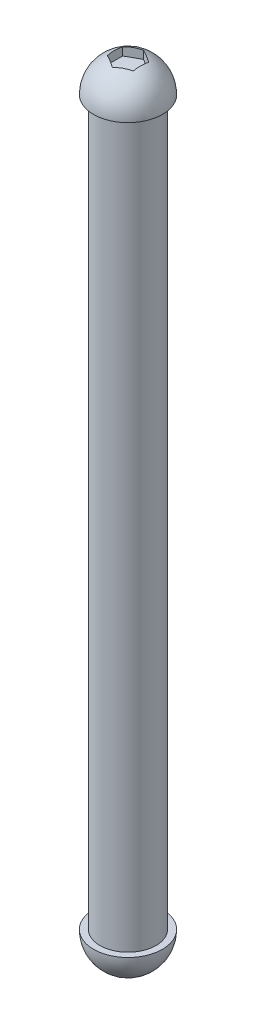
ISO-10303-21;
HEADER;
FILE_DESCRIPTION(('STEP AP214'),'2;1');
FILE_NAME('part.step','',(''),(''),'','','');
FILE_SCHEMA(('AUTOMOTIVE_DESIGN { 1 0 10303 214 1 1 1 1 }'));
ENDSEC;
DATA;
#1=APPLICATION_CONTEXT('core data for automotive mechanical design processes');
#2=APPLICATION_PROTOCOL_DEFINITION('international standard','automotive_design',2000,#1);
#3=PRODUCT_CONTEXT('',#1,'mechanical');
#4=PRODUCT('Part','Part','',(#3));
#5=PRODUCT_RELATED_PRODUCT_CATEGORY('part','',(#4));
#6=PRODUCT_DEFINITION_FORMATION('','',#4);
#7=PRODUCT_DEFINITION_CONTEXT('part definition',#1,'design');
#8=PRODUCT_DEFINITION('design','',#6,#7);
#9=PRODUCT_DEFINITION_SHAPE('','',#8);
#10=(LENGTH_UNIT() NAMED_UNIT(*) SI_UNIT(.MILLI.,.METRE.));
#11=(NAMED_UNIT(*) PLANE_ANGLE_UNIT() SI_UNIT($,.RADIAN.));
#12=(NAMED_UNIT(*) SI_UNIT($,.STERADIAN.) SOLID_ANGLE_UNIT());
#13=UNCERTAINTY_MEASURE_WITH_UNIT(LENGTH_MEASURE(1.E-05),#10,'distance_accuracy_value','');
#14=(GEOMETRIC_REPRESENTATION_CONTEXT(3) GLOBAL_UNCERTAINTY_ASSIGNED_CONTEXT((#13)) GLOBAL_UNIT_ASSIGNED_CONTEXT((#10,
#11,#12)) REPRESENTATION_CONTEXT('',''));
#15=CARTESIAN_POINT('',(0.,0.,0.));
#16=DIRECTION('',(0.,0.,1.));
#17=DIRECTION('',(1.,0.,0.));
#18=AXIS2_PLACEMENT_3D('',#15,#16,#17);
#19=CARTESIAN_POINT('',(0.,0.,0.));
#20=DIRECTION('',(0.0757388786567332,0.,-0.997127686036157));
#21=DIRECTION('',(-0.997127686036157,0.,-0.0757388786567332));
#22=AXIS2_PLACEMENT_3D('',#19,#20,#21);
#23=SPHERICAL_SURFACE('',#22,3.);
#24=CARTESIAN_POINT('',(-0.591036564901015,0.,0.987830611369554));
#25=DIRECTION('',(-0.513433884385675,0.,0.858129154827312));
#26=DIRECTION('',(0.858129154827312,0.,0.513433884385675));
#27=AXIS2_PLACEMENT_3D('',#24,#25,#26);
#28=CIRCLE('',#27,2.77035493433446);
#29=CARTESIAN_POINT('',(-0.0207122955130502,-2.68945259912156,1.32906573121607));
#30=VERTEX_POINT('',#29);
#31=CARTESIAN_POINT('',(-1.16136083428898,-2.68945259912156,0.646595491523041));
#32=VERTEX_POINT('',#31);
#33=EDGE_CURVE('E48',#30,#32,#28,.F.);
#34=ORIENTED_EDGE('',*,*,#33,.F.);
#35=CARTESIAN_POINT('',(0.559968121631439,0.,1.00576798545455));
#36=DIRECTION('',(0.486444705615685,0.,0.873711364455373));
#37=DIRECTION('',(0.873711364455373,0.,-0.486444705615685));
#38=AXIS2_PLACEMENT_3D('',#35,#36,#37);
#39=CIRCLE('',#38,2.77035493433446);
#40=CARTESIAN_POINT('',(1.14064853877593,-2.68945259912156,0.682470239693026));
#41=VERTEX_POINT('',#40);
#42=EDGE_CURVE('E63',#41,#30,#39,.F.);
#43=ORIENTED_EDGE('',*,*,#42,.F.);
#44=CARTESIAN_POINT('',(1.15100468653246,0.,0.0179373740849928));
#45=DIRECTION('',(0.99987859000136,0.,0.0155822096280604));
#46=DIRECTION('',(0.0155822096280604,0.,-0.99987859000136));
#47=AXIS2_PLACEMENT_3D('',#44,#45,#46);
#48=CIRCLE('',#47,2.77035493433446);
#49=CARTESIAN_POINT('',(1.16136083428898,-2.68945259912156,-0.646595491523042));
#50=VERTEX_POINT('',#49);
#51=EDGE_CURVE('E233',#50,#41,#48,.F.);
#52=ORIENTED_EDGE('',*,*,#51,.F.);
#53=CARTESIAN_POINT('',(0.591036564901016,0.,-0.987830611369555));
#54=DIRECTION('',(0.513433884385675,0.,-0.858129154827312));
#55=DIRECTION('',(-0.858129154827312,0.,-0.513433884385675));
#56=AXIS2_PLACEMENT_3D('',#53,#54,#55);
#57=CIRCLE('',#56,2.77035493433446);
#58=CARTESIAN_POINT('',(0.0207122955130501,-2.68945259912156,-1.32906573121607));
#59=VERTEX_POINT('',#58);
#60=EDGE_CURVE('E231',#59,#50,#57,.F.);
#61=ORIENTED_EDGE('',*,*,#60,.F.);
#62=CARTESIAN_POINT('',(-0.559968121631441,0.,-1.00576798545455));
#63=DIRECTION('',(-0.486444705615685,0.,-0.873711364455373));
#64=DIRECTION('',(-0.873711364455373,0.,0.486444705615685));
#65=AXIS2_PLACEMENT_3D('',#62,#63,#64);
#66=CIRCLE('',#65,2.77035493433446);
#67=CARTESIAN_POINT('',(-1.14064853877593,-2.68945259912156,-0.682470239693026));
#68=VERTEX_POINT('',#67);
#69=EDGE_CURVE('E229',#68,#59,#66,.F.);
#70=ORIENTED_EDGE('',*,*,#69,.F.);
#71=CARTESIAN_POINT('',(-1.15100468653246,0.,-0.0179373740849914));
#72=DIRECTION('',(-0.99987859000136,0.,-0.0155822096280607));
#73=DIRECTION('',(-0.0155822096280607,0.,0.99987859000136));
#74=AXIS2_PLACEMENT_3D('',#71,#72,#73);
#75=CIRCLE('',#74,2.77035493433446);
#76=EDGE_CURVE('E227',#32,#68,#75,.F.);
#77=ORIENTED_EDGE('',*,*,#76,.F.);
#78=EDGE_LOOP('',(#34,#43,#52,#61,#70,#77));
#79=FACE_BOUND('',#78,.T.);
#80=CARTESIAN_POINT('',(0.,0.,0.));
#81=DIRECTION('',(0.,-1.,0.));
#82=DIRECTION('',(-0.151042665635923,0.,0.988527244519642));
#83=AXIS2_PLACEMENT_3D('',#80,#81,#82);
#84=CIRCLE('',#83,3.);
#85=CARTESIAN_POINT('',(-0.45312799690777,0.,2.96558173355893));
#86=VERTEX_POINT('',#85);
#87=EDGE_CURVE('E212',#86,#86,#84,.T.);
#88=ORIENTED_EDGE('',*,*,#87,.T.);
#89=EDGE_LOOP('',(#88));
#90=FACE_BOUND('',#89,.T.);
#91=ADVANCED_FACE('F41',(#79,#90),#23,.T.);
#92=CARTESIAN_POINT('',(0.,0.,0.));
#93=DIRECTION('',(0.,-1.,0.));
#94=DIRECTION('',(-0.151042665635923,0.,0.988527244519642));
#95=AXIS2_PLACEMENT_3D('',#92,#93,#94);
#96=PLANE('',#95);
#97=CARTESIAN_POINT('',(0.,0.,0.));
#98=DIRECTION('',(0.,-1.,0.));
#99=DIRECTION('',(1.,0.,0.));
#100=AXIS2_PLACEMENT_3D('',#97,#98,#99);
#101=CIRCLE('',#100,2.44);
#102=CARTESIAN_POINT('',(2.44,0.,0.));
#103=VERTEX_POINT('',#102);
#104=EDGE_CURVE('E11',#103,#103,#101,.F.);
#105=ORIENTED_EDGE('',*,*,#104,.F.);
#106=EDGE_LOOP('',(#105));
#107=FACE_BOUND('',#106,.T.);
#108=ORIENTED_EDGE('',*,*,#87,.F.);
#109=EDGE_LOOP('',(#108));
#110=FACE_BOUND('',#109,.T.);
#111=ADVANCED_FACE('F268',(#107,#110),#96,.F.);
#112=CARTESIAN_POINT('',(-0.0207122955130502,-2.,1.32906573121607));
#113=DIRECTION('',(-0.513433884385675,0.,0.858129154827312));
#114=DIRECTION('',(0.858129154827312,0.,0.513433884385675));
#115=AXIS2_PLACEMENT_3D('',#112,#113,#114);
#116=PLANE('',#115);
#117=ORIENTED_EDGE('',*,*,#33,.T.);
#118=DIRECTION('',(0.,-1.,0.));
#119=VECTOR('',#118,1.);
#120=CARTESIAN_POINT('',(-1.16136083428898,-2.,0.646595491523041));
#121=LINE('',#120,#119);
#122=CARTESIAN_POINT('',(-1.16136083428898,-2.,0.646595491523041));
#123=VERTEX_POINT('',#122);
#124=EDGE_CURVE('E55',#123,#32,#121,.T.);
#125=ORIENTED_EDGE('',*,*,#124,.F.);
#126=DIRECTION('',(-0.858129154827312,0.,-0.513433884385675));
#127=VECTOR('',#126,1.);
#128=CARTESIAN_POINT('',(-0.0207122955130502,-2.,1.32906573121607));
#129=LINE('',#128,#127);
#130=CARTESIAN_POINT('',(-0.0207122955130502,-2.,1.32906573121607));
#131=VERTEX_POINT('',#130);
#132=EDGE_CURVE('E192',#131,#123,#129,.T.);
#133=ORIENTED_EDGE('',*,*,#132,.F.);
#134=DIRECTION('',(0.,-1.,0.));
#135=VECTOR('',#134,1.);
#136=CARTESIAN_POINT('',(-0.0207122955130502,-2.,1.32906573121607));
#137=LINE('',#136,#135);
#138=EDGE_CURVE('E210',#131,#30,#137,.T.);
#139=ORIENTED_EDGE('',*,*,#138,.T.);
#140=EDGE_LOOP('',(#117,#125,#133,#139));
#141=FACE_BOUND('',#140,.T.);
#142=ADVANCED_FACE('F238',(#141),#116,.F.);
#143=CARTESIAN_POINT('',(1.14064853877593,-2.,0.682470239693025));
#144=DIRECTION('',(0.486444705615685,0.,0.873711364455373));
#145=DIRECTION('',(0.873711364455373,0.,-0.486444705615685));
#146=AXIS2_PLACEMENT_3D('',#143,#144,#145);
#147=PLANE('',#146);
#148=ORIENTED_EDGE('',*,*,#42,.T.);
#149=ORIENTED_EDGE('',*,*,#138,.F.);
#150=DIRECTION('',(-0.873711364455373,0.,0.486444705615685));
#151=VECTOR('',#150,1.);
#152=CARTESIAN_POINT('',(1.14064853877593,-2.,0.682470239693025));
#153=LINE('',#152,#151);
#154=CARTESIAN_POINT('',(1.14064853877593,-2.,0.682470239693025));
#155=VERTEX_POINT('',#154);
#156=EDGE_CURVE('E207',#155,#131,#153,.T.);
#157=ORIENTED_EDGE('',*,*,#156,.F.);
#158=DIRECTION('',(0.,-1.,0.));
#159=VECTOR('',#158,1.);
#160=CARTESIAN_POINT('',(1.14064853877593,-2.,0.682470239693025));
#161=LINE('',#160,#159);
#162=EDGE_CURVE('E213',#155,#41,#161,.T.);
#163=ORIENTED_EDGE('',*,*,#162,.T.);
#164=EDGE_LOOP('',(#148,#149,#157,#163));
#165=FACE_BOUND('',#164,.T.);
#166=ADVANCED_FACE('F253',(#165),#147,.F.);
#167=CARTESIAN_POINT('',(1.16136083428898,-2.,-0.646595491523042));
#168=DIRECTION('',(0.99987859000136,0.,0.0155822096280604));
#169=DIRECTION('',(0.0155822096280604,0.,-0.99987859000136));
#170=AXIS2_PLACEMENT_3D('',#167,#168,#169);
#171=PLANE('',#170);
#172=ORIENTED_EDGE('',*,*,#51,.T.);
#173=ORIENTED_EDGE('',*,*,#162,.F.);
#174=DIRECTION('',(-0.0155822096280604,0.,0.99987859000136));
#175=VECTOR('',#174,1.);
#176=CARTESIAN_POINT('',(1.16136083428898,-2.,-0.646595491523042));
#177=LINE('',#176,#175);
#178=CARTESIAN_POINT('',(1.16136083428898,-2.,-0.646595491523042));
#179=VERTEX_POINT('',#178);
#180=EDGE_CURVE('E204',#179,#155,#177,.T.);
#181=ORIENTED_EDGE('',*,*,#180,.F.);
#182=DIRECTION('',(0.,-1.,0.));
#183=VECTOR('',#182,1.);
#184=CARTESIAN_POINT('',(1.16136083428898,-2.,-0.646595491523042));
#185=LINE('',#184,#183);
#186=EDGE_CURVE('E215',#179,#50,#185,.T.);
#187=ORIENTED_EDGE('',*,*,#186,.T.);
#188=EDGE_LOOP('',(#172,#173,#181,#187));
#189=FACE_BOUND('',#188,.T.);
#190=ADVANCED_FACE('F256',(#189),#171,.F.);
#191=CARTESIAN_POINT('',(0.0207122955130502,-2.,-1.32906573121607));
#192=DIRECTION('',(0.513433884385675,0.,-0.858129154827312));
#193=DIRECTION('',(-0.858129154827312,0.,-0.513433884385675));
#194=AXIS2_PLACEMENT_3D('',#191,#192,#193);
#195=PLANE('',#194);
#196=ORIENTED_EDGE('',*,*,#60,.T.);
#197=ORIENTED_EDGE('',*,*,#186,.F.);
#198=DIRECTION('',(0.858129154827312,0.,0.513433884385675));
#199=VECTOR('',#198,1.);
#200=CARTESIAN_POINT('',(0.0207122955130502,-2.,-1.32906573121607));
#201=LINE('',#200,#199);
#202=CARTESIAN_POINT('',(0.0207122955130502,-2.,-1.32906573121607));
#203=VERTEX_POINT('',#202);
#204=EDGE_CURVE('E201',#203,#179,#201,.T.);
#205=ORIENTED_EDGE('',*,*,#204,.F.);
#206=DIRECTION('',(0.,-1.,0.));
#207=VECTOR('',#206,1.);
#208=CARTESIAN_POINT('',(0.0207122955130502,-2.,-1.32906573121607));
#209=LINE('',#208,#207);
#210=EDGE_CURVE('E218',#203,#59,#209,.T.);
#211=ORIENTED_EDGE('',*,*,#210,.T.);
#212=EDGE_LOOP('',(#196,#197,#205,#211));
#213=FACE_BOUND('',#212,.T.);
#214=ADVANCED_FACE('F258',(#213),#195,.F.);
#215=CARTESIAN_POINT('',(-1.14064853877593,-2.,-0.682470239693026));
#216=DIRECTION('',(-0.486444705615685,0.,-0.873711364455373));
#217=DIRECTION('',(-0.873711364455373,0.,0.486444705615685));
#218=AXIS2_PLACEMENT_3D('',#215,#216,#217);
#219=PLANE('',#218);
#220=ORIENTED_EDGE('',*,*,#69,.T.);
#221=ORIENTED_EDGE('',*,*,#210,.F.);
#222=DIRECTION('',(0.873711364455373,0.,-0.486444705615685));
#223=VECTOR('',#222,1.);
#224=CARTESIAN_POINT('',(-1.14064853877593,-2.,-0.682470239693026));
#225=LINE('',#224,#223);
#226=CARTESIAN_POINT('',(-1.14064853877593,-2.,-0.682470239693026));
#227=VERTEX_POINT('',#226);
#228=EDGE_CURVE('E198',#227,#203,#225,.T.);
#229=ORIENTED_EDGE('',*,*,#228,.F.);
#230=DIRECTION('',(0.,-1.,0.));
#231=VECTOR('',#230,1.);
#232=CARTESIAN_POINT('',(-1.14064853877593,-2.,-0.682470239693026));
#233=LINE('',#232,#231);
#234=EDGE_CURVE('E221',#227,#68,#233,.T.);
#235=ORIENTED_EDGE('',*,*,#234,.T.);
#236=EDGE_LOOP('',(#220,#221,#229,#235));
#237=FACE_BOUND('',#236,.T.);
#238=ADVANCED_FACE('F247',(#237),#219,.F.);
#239=CARTESIAN_POINT('',(-1.16136083428898,-2.,0.646595491523041));
#240=DIRECTION('',(-0.99987859000136,0.,-0.0155822096280607));
#241=DIRECTION('',(-0.0155822096280607,0.,0.99987859000136));
#242=AXIS2_PLACEMENT_3D('',#239,#240,#241);
#243=PLANE('',#242);
#244=ORIENTED_EDGE('',*,*,#76,.T.);
#245=ORIENTED_EDGE('',*,*,#234,.F.);
#246=DIRECTION('',(0.0155822096280607,0.,-0.99987859000136));
#247=VECTOR('',#246,1.);
#248=CARTESIAN_POINT('',(-1.16136083428898,-2.,0.646595491523041));
#249=LINE('',#248,#247);
#250=EDGE_CURVE('E195',#123,#227,#249,.T.);
#251=ORIENTED_EDGE('',*,*,#250,.F.);
#252=ORIENTED_EDGE('',*,*,#124,.T.);
#253=EDGE_LOOP('',(#244,#245,#251,#252));
#254=FACE_BOUND('',#253,.T.);
#255=ADVANCED_FACE('F244',(#254),#243,.F.);
#256=CARTESIAN_POINT('',(0.,-2.,0.));
#257=DIRECTION('',(0.,-1.,0.));
#258=DIRECTION('',(0.,0.,-1.));
#259=AXIS2_PLACEMENT_3D('',#256,#257,#258);
#260=PLANE('',#259);
#261=ORIENTED_EDGE('',*,*,#132,.T.);
#262=ORIENTED_EDGE('',*,*,#250,.T.);
#263=ORIENTED_EDGE('',*,*,#228,.T.);
#264=ORIENTED_EDGE('',*,*,#204,.T.);
#265=ORIENTED_EDGE('',*,*,#180,.T.);
#266=ORIENTED_EDGE('',*,*,#156,.T.);
#267=EDGE_LOOP('',(#261,#262,#263,#264,#265,#266));
#268=FACE_BOUND('',#267,.T.);
#269=ADVANCED_FACE('F250',(#268),#260,.T.);
#270=CARTESIAN_POINT('',(-2.19331520619062E-13,31.5,0.));
#271=DIRECTION('',(0.,-1.,0.));
#272=DIRECTION('',(1.,0.,0.));
#273=AXIS2_PLACEMENT_3D('',#270,#271,#272);
#274=CYLINDRICAL_SURFACE('',#273,2.44);
#275=ORIENTED_EDGE('',*,*,#104,.T.);
#276=EDGE_LOOP('',(#275));
#277=FACE_BOUND('',#276,.T.);
#278=CARTESIAN_POINT('',(-4.38663041238124E-13,63.,0.));
#279=DIRECTION('',(0.,-1.,0.));
#280=DIRECTION('',(1.,0.,0.));
#281=AXIS2_PLACEMENT_3D('',#278,#279,#280);
#282=CIRCLE('',#281,2.44);
#283=CARTESIAN_POINT('',(2.43999999999956,63.,0.));
#284=VERTEX_POINT('',#283);
#285=EDGE_CURVE('E189',#284,#284,#282,.F.);
#286=ORIENTED_EDGE('',*,*,#285,.F.);
#287=EDGE_LOOP('',(#286));
#288=FACE_BOUND('',#287,.T.);
#289=ADVANCED_FACE('F284',(#277,#288),#274,.T.);
#290=CARTESIAN_POINT('',(-4.38771461455372E-13,63.,0.));
#291=DIRECTION('',(0.0757388786567332,0.,-0.997127686036157));
#292=DIRECTION('',(-0.997127686036157,0.,-0.0757388786567332));
#293=AXIS2_PLACEMENT_3D('',#290,#291,#292);
#294=SPHERICAL_SURFACE('',#293,3.);
#295=CARTESIAN_POINT('',(-0.591036564901454,63.,0.987830611369521));
#296=DIRECTION('',(0.513433884385675,0.,-0.858129154827312));
#297=DIRECTION('',(0.858129154827312,0.,0.513433884385675));
#298=AXIS2_PLACEMENT_3D('',#295,#296,#297);
#299=CIRCLE('',#298,2.77035493433446);
#300=CARTESIAN_POINT('',(-0.0207122955135263,65.6894525991216,1.32906573121603));
#301=VERTEX_POINT('',#300);
#302=CARTESIAN_POINT('',(-1.16136083428946,65.6894525991215,0.646595491523005));
#303=VERTEX_POINT('',#302);
#304=EDGE_CURVE('E187',#301,#303,#299,.F.);
#305=ORIENTED_EDGE('',*,*,#304,.T.);
#306=CARTESIAN_POINT('',(-1.15100468653289,63.,-0.0179373740850248));
#307=DIRECTION('',(0.99987859000136,0.,0.0155822096280607));
#308=DIRECTION('',(-0.0155822096280607,0.,0.99987859000136));
#309=AXIS2_PLACEMENT_3D('',#306,#307,#308);
#310=CIRCLE('',#309,2.77035493433446);
#311=CARTESIAN_POINT('',(-1.14064853877641,65.6894525991215,-0.682470239693062));
#312=VERTEX_POINT('',#311);
#313=EDGE_CURVE('E146',#303,#312,#310,.F.);
#314=ORIENTED_EDGE('',*,*,#313,.T.);
#315=CARTESIAN_POINT('',(-0.559968121631879,63.,-1.00576798545458));
#316=DIRECTION('',(0.486444705615685,0.,0.873711364455373));
#317=DIRECTION('',(-0.873711364455373,0.,0.486444705615685));
#318=AXIS2_PLACEMENT_3D('',#315,#316,#317);
#319=CIRCLE('',#318,2.77035493433446);
#320=CARTESIAN_POINT('',(0.020712295512574,65.6894525991216,-1.3290657312161));
#321=VERTEX_POINT('',#320);
#322=EDGE_CURVE('E175',#312,#321,#319,.F.);
#323=ORIENTED_EDGE('',*,*,#322,.T.);
#324=CARTESIAN_POINT('',(0.591036564900577,63.,-0.987830611369588));
#325=DIRECTION('',(-0.513433884385675,0.,0.858129154827312));
#326=DIRECTION('',(-0.858129154827312,0.,-0.513433884385675));
#327=AXIS2_PLACEMENT_3D('',#324,#325,#326);
#328=CIRCLE('',#327,2.77035493433446);
#329=CARTESIAN_POINT('',(1.1613608342885,65.6894525991216,-0.646595491523078));
#330=VERTEX_POINT('',#329);
#331=EDGE_CURVE('E178',#321,#330,#328,.F.);
#332=ORIENTED_EDGE('',*,*,#331,.T.);
#333=CARTESIAN_POINT('',(1.15100468653202,63.,0.0179373740849595));
#334=DIRECTION('',(-0.99987859000136,0.,-0.0155822096280604));
#335=DIRECTION('',(0.0155822096280604,0.,-0.99987859000136));
#336=AXIS2_PLACEMENT_3D('',#333,#334,#335);
#337=CIRCLE('',#336,2.77035493433446);
#338=CARTESIAN_POINT('',(1.14064853877545,65.6894525991216,0.682470239692989));
#339=VERTEX_POINT('',#338);
#340=EDGE_CURVE('E181',#330,#339,#337,.F.);
#341=ORIENTED_EDGE('',*,*,#340,.T.);
#342=CARTESIAN_POINT('',(0.559968121631001,63.,1.00576798545451));
#343=DIRECTION('',(-0.486444705615685,0.,-0.873711364455373));
#344=DIRECTION('',(0.873711364455373,0.,-0.486444705615685));
#345=AXIS2_PLACEMENT_3D('',#342,#343,#344);
#346=CIRCLE('',#345,2.77035493433446);
#347=EDGE_CURVE('E184',#339,#301,#346,.F.);
#348=ORIENTED_EDGE('',*,*,#347,.T.);
#349=EDGE_LOOP('',(#305,#314,#323,#332,#341,#348));
#350=FACE_BOUND('',#349,.T.);
#351=CARTESIAN_POINT('',(-4.38771461455372E-13,63.,0.));
#352=DIRECTION('',(0.,-1.,0.));
#353=DIRECTION('',(-0.151042665635923,0.,0.988527244519642));
#354=AXIS2_PLACEMENT_3D('',#351,#352,#353);
#355=CIRCLE('',#354,3.);
#356=CARTESIAN_POINT('',(-0.453127996908209,63.,2.9655817335589));
#357=VERTEX_POINT('',#356);
#358=EDGE_CURVE('E164',#357,#357,#355,.T.);
#359=ORIENTED_EDGE('',*,*,#358,.F.);
#360=EDGE_LOOP('',(#359));
#361=FACE_BOUND('',#360,.T.);
#362=ADVANCED_FACE('F289',(#350,#361),#294,.T.);
#363=CARTESIAN_POINT('',(-4.38771461455372E-13,63.,0.));
#364=DIRECTION('',(0.,1.,0.));
#365=DIRECTION('',(-0.151042665635923,0.,0.988527244519642));
#366=AXIS2_PLACEMENT_3D('',#363,#364,#365);
#367=PLANE('',#366);
#368=ORIENTED_EDGE('',*,*,#285,.T.);
#369=EDGE_LOOP('',(#368));
#370=FACE_BOUND('',#369,.T.);
#371=ORIENTED_EDGE('',*,*,#358,.T.);
#372=EDGE_LOOP('',(#371));
#373=FACE_BOUND('',#372,.T.);
#374=ADVANCED_FACE('F356',(#370,#373),#367,.F.);
#375=CARTESIAN_POINT('',(-0.0207122955135167,65.,1.32906573121603));
#376=DIRECTION('',(-0.513433884385675,0.,0.858129154827312));
#377=DIRECTION('',(0.858129154827312,0.,0.513433884385675));
#378=AXIS2_PLACEMENT_3D('',#375,#376,#377);
#379=PLANE('',#378);
#380=ORIENTED_EDGE('',*,*,#304,.F.);
#381=DIRECTION('',(0.,1.,0.));
#382=VECTOR('',#381,1.);
#383=CARTESIAN_POINT('',(-0.0207122955135167,65.,1.32906573121603));
#384=LINE('',#383,#382);
#385=CARTESIAN_POINT('',(-0.0207122955135167,65.,1.32906573121603));
#386=VERTEX_POINT('',#385);
#387=EDGE_CURVE('E154',#386,#301,#384,.T.);
#388=ORIENTED_EDGE('',*,*,#387,.F.);
#389=DIRECTION('',(-0.858129154827312,0.,-0.513433884385675));
#390=VECTOR('',#389,1.);
#391=CARTESIAN_POINT('',(-0.0207122955135167,65.,1.32906573121603));
#392=LINE('',#391,#390);
#393=CARTESIAN_POINT('',(-1.16136083428945,65.,0.646595491523005));
#394=VERTEX_POINT('',#393);
#395=EDGE_CURVE('E135',#386,#394,#392,.T.);
#396=ORIENTED_EDGE('',*,*,#395,.T.);
#397=DIRECTION('',(0.,1.,0.));
#398=VECTOR('',#397,1.);
#399=CARTESIAN_POINT('',(-1.16136083428945,65.,0.646595491523005));
#400=LINE('',#399,#398);
#401=EDGE_CURVE('E143',#394,#303,#400,.T.);
#402=ORIENTED_EDGE('',*,*,#401,.T.);
#403=EDGE_LOOP('',(#380,#388,#396,#402));
#404=FACE_BOUND('',#403,.T.);
#405=ADVANCED_FACE('F153',(#404),#379,.F.);
#406=CARTESIAN_POINT('',(1.14064853877546,65.,0.68247023969299));
#407=DIRECTION('',(0.486444705615685,0.,0.873711364455373));
#408=DIRECTION('',(0.873711364455373,0.,-0.486444705615685));
#409=AXIS2_PLACEMENT_3D('',#406,#407,#408);
#410=PLANE('',#409);
#411=ORIENTED_EDGE('',*,*,#347,.F.);
#412=DIRECTION('',(0.,1.,0.));
#413=VECTOR('',#412,1.);
#414=CARTESIAN_POINT('',(1.14064853877546,65.,0.68247023969299));
#415=LINE('',#414,#413);
#416=CARTESIAN_POINT('',(1.14064853877546,65.,0.68247023969299));
#417=VERTEX_POINT('',#416);
#418=EDGE_CURVE('E165',#417,#339,#415,.T.);
#419=ORIENTED_EDGE('',*,*,#418,.F.);
#420=DIRECTION('',(-0.873711364455373,0.,0.486444705615685));
#421=VECTOR('',#420,1.);
#422=CARTESIAN_POINT('',(1.14064853877546,65.,0.68247023969299));
#423=LINE('',#422,#421);
#424=EDGE_CURVE('E151',#417,#386,#423,.T.);
#425=ORIENTED_EDGE('',*,*,#424,.T.);
#426=ORIENTED_EDGE('',*,*,#387,.T.);
#427=EDGE_LOOP('',(#411,#419,#425,#426));
#428=FACE_BOUND('',#427,.T.);
#429=ADVANCED_FACE('F379',(#428),#410,.F.);
#430=CARTESIAN_POINT('',(1.16136083428851,65.,-0.646595491523077));
#431=DIRECTION('',(0.99987859000136,0.,0.0155822096280604));
#432=DIRECTION('',(0.0155822096280604,0.,-0.99987859000136));
#433=AXIS2_PLACEMENT_3D('',#430,#431,#432);
#434=PLANE('',#433);
#435=ORIENTED_EDGE('',*,*,#340,.F.);
#436=DIRECTION('',(0.,1.,0.));
#437=VECTOR('',#436,1.);
#438=CARTESIAN_POINT('',(1.16136083428851,65.,-0.646595491523077));
#439=LINE('',#438,#437);
#440=CARTESIAN_POINT('',(1.16136083428851,65.,-0.646595491523077));
#441=VERTEX_POINT('',#440);
#442=EDGE_CURVE('E167',#441,#330,#439,.T.);
#443=ORIENTED_EDGE('',*,*,#442,.F.);
#444=DIRECTION('',(-0.0155822096280604,0.,0.99987859000136));
#445=VECTOR('',#444,1.);
#446=CARTESIAN_POINT('',(1.16136083428851,65.,-0.646595491523077));
#447=LINE('',#446,#445);
#448=EDGE_CURVE('E160',#441,#417,#447,.T.);
#449=ORIENTED_EDGE('',*,*,#448,.T.);
#450=ORIENTED_EDGE('',*,*,#418,.T.);
#451=EDGE_LOOP('',(#435,#443,#449,#450));
#452=FACE_BOUND('',#451,.T.);
#453=ADVANCED_FACE('F389',(#452),#434,.F.);
#454=CARTESIAN_POINT('',(0.0207122955125837,65.,-1.3290657312161));
#455=DIRECTION('',(0.513433884385675,0.,-0.858129154827312));
#456=DIRECTION('',(-0.858129154827312,0.,-0.513433884385675));
#457=AXIS2_PLACEMENT_3D('',#454,#455,#456);
#458=PLANE('',#457);
#459=ORIENTED_EDGE('',*,*,#331,.F.);
#460=DIRECTION('',(0.,1.,0.));
#461=VECTOR('',#460,1.);
#462=CARTESIAN_POINT('',(0.0207122955125837,65.,-1.3290657312161));
#463=LINE('',#462,#461);
#464=CARTESIAN_POINT('',(0.0207122955125837,65.,-1.3290657312161));
#465=VERTEX_POINT('',#464);
#466=EDGE_CURVE('E169',#465,#321,#463,.T.);
#467=ORIENTED_EDGE('',*,*,#466,.F.);
#468=DIRECTION('',(0.858129154827312,0.,0.513433884385675));
#469=VECTOR('',#468,1.);
#470=CARTESIAN_POINT('',(0.0207122955125837,65.,-1.3290657312161));
#471=LINE('',#470,#469);
#472=EDGE_CURVE('E158',#465,#441,#471,.T.);
#473=ORIENTED_EDGE('',*,*,#472,.T.);
#474=ORIENTED_EDGE('',*,*,#442,.T.);
#475=EDGE_LOOP('',(#459,#467,#473,#474));
#476=FACE_BOUND('',#475,.T.);
#477=ADVANCED_FACE('F400',(#476),#458,.F.);
#478=CARTESIAN_POINT('',(-1.1406485387764,65.,-0.682470239693062));
#479=DIRECTION('',(-0.486444705615685,0.,-0.873711364455373));
#480=DIRECTION('',(-0.873711364455373,0.,0.486444705615685));
#481=AXIS2_PLACEMENT_3D('',#478,#479,#480);
#482=PLANE('',#481);
#483=ORIENTED_EDGE('',*,*,#322,.F.);
#484=DIRECTION('',(0.,1.,0.));
#485=VECTOR('',#484,1.);
#486=CARTESIAN_POINT('',(-1.1406485387764,65.,-0.682470239693062));
#487=LINE('',#486,#485);
#488=CARTESIAN_POINT('',(-1.1406485387764,65.,-0.682470239693062));
#489=VERTEX_POINT('',#488);
#490=EDGE_CURVE('E150',#489,#312,#487,.T.);
#491=ORIENTED_EDGE('',*,*,#490,.F.);
#492=DIRECTION('',(0.873711364455373,0.,-0.486444705615685));
#493=VECTOR('',#492,1.);
#494=CARTESIAN_POINT('',(-1.1406485387764,65.,-0.682470239693062));
#495=LINE('',#494,#493);
#496=EDGE_CURVE('E138',#489,#465,#495,.T.);
#497=ORIENTED_EDGE('',*,*,#496,.T.);
#498=ORIENTED_EDGE('',*,*,#466,.T.);
#499=EDGE_LOOP('',(#483,#491,#497,#498));
#500=FACE_BOUND('',#499,.T.);
#501=ADVANCED_FACE('F411',(#500),#482,.F.);
#502=CARTESIAN_POINT('',(-1.16136083428945,65.,0.646595491523005));
#503=DIRECTION('',(-0.99987859000136,0.,-0.0155822096280607));
#504=DIRECTION('',(-0.0155822096280607,0.,0.99987859000136));
#505=AXIS2_PLACEMENT_3D('',#502,#503,#504);
#506=PLANE('',#505);
#507=ORIENTED_EDGE('',*,*,#313,.F.);
#508=ORIENTED_EDGE('',*,*,#401,.F.);
#509=DIRECTION('',(0.0155822096280607,0.,-0.99987859000136));
#510=VECTOR('',#509,1.);
#511=CARTESIAN_POINT('',(-1.16136083428945,65.,0.646595491523005));
#512=LINE('',#511,#510);
#513=EDGE_CURVE('E130',#394,#489,#512,.T.);
#514=ORIENTED_EDGE('',*,*,#513,.T.);
#515=ORIENTED_EDGE('',*,*,#490,.T.);
#516=EDGE_LOOP('',(#507,#508,#514,#515));
#517=FACE_BOUND('',#516,.T.);
#518=ADVANCED_FACE('F144',(#517),#506,.F.);
#519=CARTESIAN_POINT('',(-4.66514662904036E-13,65.,0.));
#520=DIRECTION('',(0.,1.,0.));
#521=DIRECTION('',(0.,0.,-1.));
#522=AXIS2_PLACEMENT_3D('',#519,#520,#521);
#523=PLANE('',#522);
#524=ORIENTED_EDGE('',*,*,#395,.F.);
#525=ORIENTED_EDGE('',*,*,#424,.F.);
#526=ORIENTED_EDGE('',*,*,#448,.F.);
#527=ORIENTED_EDGE('',*,*,#472,.F.);
#528=ORIENTED_EDGE('',*,*,#496,.F.);
#529=ORIENTED_EDGE('',*,*,#513,.F.);
#530=EDGE_LOOP('',(#524,#525,#526,#527,#528,#529));
#531=FACE_BOUND('',#530,.T.);
#532=ADVANCED_FACE('F132',(#531),#523,.T.);
#533=CLOSED_SHELL('',(#91,#111,#142,#166,#190,#214,#238,#255,#269,#289,#362,#374,#405,#429,#453,
#477,#501,#518,#532));
#534=MANIFOLD_SOLID_BREP('B2',#533);
#535=ADVANCED_BREP_SHAPE_REPRESENTATION('',(#18,#534),#14);
#536=SHAPE_DEFINITION_REPRESENTATION(#9,#535);
ENDSEC;
END-ISO-10303-21;
